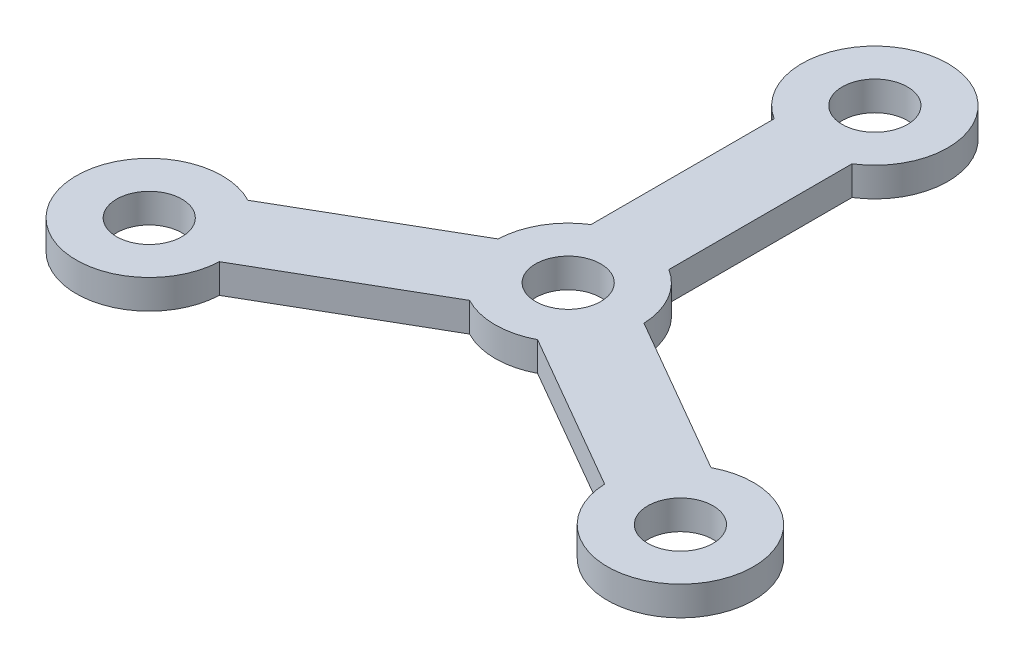
ISO-10303-21;
HEADER;
FILE_DESCRIPTION(('STEP AP214'),'2;1');
FILE_NAME('part.step','',(''),(''),'','','');
FILE_SCHEMA(('AUTOMOTIVE_DESIGN { 1 0 10303 214 1 1 1 1 }'));
ENDSEC;
DATA;
#1=APPLICATION_CONTEXT('core data for automotive mechanical design processes');
#2=APPLICATION_PROTOCOL_DEFINITION('international standard','automotive_design',2000,#1);
#3=PRODUCT_CONTEXT('',#1,'mechanical');
#4=PRODUCT('Part','Part','',(#3));
#5=PRODUCT_RELATED_PRODUCT_CATEGORY('part','',(#4));
#6=PRODUCT_DEFINITION_FORMATION('','',#4);
#7=PRODUCT_DEFINITION_CONTEXT('part definition',#1,'design');
#8=PRODUCT_DEFINITION('design','',#6,#7);
#9=PRODUCT_DEFINITION_SHAPE('','',#8);
#10=(LENGTH_UNIT() NAMED_UNIT(*) SI_UNIT(.MILLI.,.METRE.));
#11=(NAMED_UNIT(*) PLANE_ANGLE_UNIT() SI_UNIT($,.RADIAN.));
#12=(NAMED_UNIT(*) SI_UNIT($,.STERADIAN.) SOLID_ANGLE_UNIT());
#13=UNCERTAINTY_MEASURE_WITH_UNIT(LENGTH_MEASURE(1.E-05),#10,'distance_accuracy_value','');
#14=(GEOMETRIC_REPRESENTATION_CONTEXT(3) GLOBAL_UNCERTAINTY_ASSIGNED_CONTEXT((#13)) GLOBAL_UNIT_ASSIGNED_CONTEXT((#10,
#11,#12)) REPRESENTATION_CONTEXT('',''));
#15=CARTESIAN_POINT('',(0.,0.,0.));
#16=DIRECTION('',(0.,0.,1.));
#17=DIRECTION('',(1.,0.,0.));
#18=AXIS2_PLACEMENT_3D('',#15,#16,#17);
#19=CARTESIAN_POINT('',(0.,3.,-31.5));
#20=DIRECTION('',(0.,-1.,0.));
#21=DIRECTION('',(0.,0.,-1.));
#22=AXIS2_PLACEMENT_3D('',#19,#20,#21);
#23=CYLINDRICAL_SURFACE('',#22,7.5);
#24=CARTESIAN_POINT('',(0.,0.,-31.5));
#25=DIRECTION('',(0.,1.,0.));
#26=DIRECTION('',(0.,0.,1.));
#27=AXIS2_PLACEMENT_3D('',#24,#25,#26);
#28=CIRCLE('',#27,7.5);
#29=CARTESIAN_POINT('',(4.,0.,-25.1557112297752));
#30=VERTEX_POINT('',#29);
#31=CARTESIAN_POINT('',(-4.,0.,-25.1557112297752));
#32=VERTEX_POINT('',#31);
#33=EDGE_CURVE('E217',#30,#32,#28,.T.);
#34=ORIENTED_EDGE('',*,*,#33,.T.);
#35=DIRECTION('',(0.,-1.,0.));
#36=VECTOR('',#35,1.);
#37=CARTESIAN_POINT('',(-4.,3.,-25.1557112297752));
#38=LINE('',#37,#36);
#39=CARTESIAN_POINT('',(-4.,3.,-25.1557112297752));
#40=VERTEX_POINT('',#39);
#41=EDGE_CURVE('E11',#40,#32,#38,.T.);
#42=ORIENTED_EDGE('',*,*,#41,.F.);
#43=CARTESIAN_POINT('',(0.,3.,-31.5));
#44=DIRECTION('',(0.,1.,0.));
#45=DIRECTION('',(0.,0.,1.));
#46=AXIS2_PLACEMENT_3D('',#43,#44,#45);
#47=CIRCLE('',#46,7.5);
#48=CARTESIAN_POINT('',(4.,3.,-25.1557112297752));
#49=VERTEX_POINT('',#48);
#50=EDGE_CURVE('E167',#49,#40,#47,.T.);
#51=ORIENTED_EDGE('',*,*,#50,.F.);
#52=DIRECTION('',(0.,-1.,0.));
#53=VECTOR('',#52,1.);
#54=CARTESIAN_POINT('',(4.,3.,-25.1557112297752));
#55=LINE('',#54,#53);
#56=EDGE_CURVE('E49',#49,#30,#55,.T.);
#57=ORIENTED_EDGE('',*,*,#56,.T.);
#58=EDGE_LOOP('',(#34,#42,#51,#57));
#59=FACE_BOUND('',#58,.T.);
#60=ADVANCED_FACE('F33',(#59),#23,.T.);
#61=CARTESIAN_POINT('',(-4.,3.,0.));
#62=DIRECTION('',(1.,0.,0.));
#63=DIRECTION('',(0.,0.,-1.));
#64=AXIS2_PLACEMENT_3D('',#61,#62,#63);
#65=PLANE('',#64);
#66=DIRECTION('',(0.,0.,1.));
#67=VECTOR('',#66,1.);
#68=CARTESIAN_POINT('',(-4.,0.,0.));
#69=LINE('',#68,#67);
#70=CARTESIAN_POINT('',(-4.,0.,-6.34428877022476));
#71=VERTEX_POINT('',#70);
#72=EDGE_CURVE('E208',#32,#71,#69,.T.);
#73=ORIENTED_EDGE('',*,*,#72,.T.);
#74=DIRECTION('',(0.,-1.,0.));
#75=VECTOR('',#74,1.);
#76=CARTESIAN_POINT('',(-4.,3.,-6.34428877022476));
#77=LINE('',#76,#75);
#78=CARTESIAN_POINT('',(-4.,3.,-6.34428877022476));
#79=VERTEX_POINT('',#78);
#80=EDGE_CURVE('E41',#79,#71,#77,.T.);
#81=ORIENTED_EDGE('',*,*,#80,.F.);
#82=DIRECTION('',(0.,0.,1.));
#83=VECTOR('',#82,1.);
#84=CARTESIAN_POINT('',(-4.,3.,0.));
#85=LINE('',#84,#83);
#86=EDGE_CURVE('E100',#40,#79,#85,.T.);
#87=ORIENTED_EDGE('',*,*,#86,.F.);
#88=ORIENTED_EDGE('',*,*,#41,.T.);
#89=EDGE_LOOP('',(#73,#81,#87,#88));
#90=FACE_BOUND('',#89,.T.);
#91=ADVANCED_FACE('F263',(#90),#65,.F.);
#92=CARTESIAN_POINT('',(0.,3.,0.));
#93=DIRECTION('',(0.,-1.,0.));
#94=DIRECTION('',(0.,0.,-1.));
#95=AXIS2_PLACEMENT_3D('',#92,#93,#94);
#96=CYLINDRICAL_SURFACE('',#95,7.5);
#97=CARTESIAN_POINT('',(0.,0.,0.));
#98=DIRECTION('',(0.,1.,0.));
#99=DIRECTION('',(0.,0.,1.));
#100=AXIS2_PLACEMENT_3D('',#97,#98,#99);
#101=CIRCLE('',#100,7.5);
#102=CARTESIAN_POINT('',(-7.49431524395721,0.,-0.291957230023937));
#103=VERTEX_POINT('',#102);
#104=EDGE_CURVE('E203',#71,#103,#101,.T.);
#105=ORIENTED_EDGE('',*,*,#104,.T.);
#106=DIRECTION('',(0.,-1.,0.));
#107=VECTOR('',#106,1.);
#108=CARTESIAN_POINT('',(-7.49431524395721,3.,-0.291957230023937));
#109=LINE('',#108,#107);
#110=CARTESIAN_POINT('',(-7.49431524395721,3.,-0.291957230023937));
#111=VERTEX_POINT('',#110);
#112=EDGE_CURVE('E197',#111,#103,#109,.T.);
#113=ORIENTED_EDGE('',*,*,#112,.F.);
#114=CARTESIAN_POINT('',(0.,3.,0.));
#115=DIRECTION('',(0.,1.,0.));
#116=DIRECTION('',(0.,0.,1.));
#117=AXIS2_PLACEMENT_3D('',#114,#115,#116);
#118=CIRCLE('',#117,7.5);
#119=EDGE_CURVE('E154',#79,#111,#118,.T.);
#120=ORIENTED_EDGE('',*,*,#119,.F.);
#121=ORIENTED_EDGE('',*,*,#80,.T.);
#122=EDGE_LOOP('',(#105,#113,#120,#121));
#123=FACE_BOUND('',#122,.T.);
#124=ADVANCED_FACE('F202',(#123),#96,.T.);
#125=CARTESIAN_POINT('',(-1.99999999999845,3.,-3.46410161513507));
#126=DIRECTION('',(-0.500000000000001,0.,-0.866025403784438));
#127=DIRECTION('',(-0.866025403784438,0.,0.500000000000001));
#128=AXIS2_PLACEMENT_3D('',#125,#126,#127);
#129=PLANE('',#128);
#130=DIRECTION('',(0.866025403784438,0.,-0.500000000000001));
#131=VECTOR('',#130,1.);
#132=CARTESIAN_POINT('',(-1.99999999999845,0.,-3.46410161513507));
#133=LINE('',#132,#131);
#134=CARTESIAN_POINT('',(-23.7854849752463,0.,9.11375399974964));
#135=VERTEX_POINT('',#134);
#136=EDGE_CURVE('E211',#135,#103,#133,.T.);
#137=ORIENTED_EDGE('',*,*,#136,.F.);
#138=DIRECTION('',(0.,-1.,0.));
#139=VECTOR('',#138,1.);
#140=CARTESIAN_POINT('',(-23.7854849752463,3.,9.11375399974964));
#141=LINE('',#140,#139);
#142=CARTESIAN_POINT('',(-23.7854849752463,3.,9.11375399974964));
#143=VERTEX_POINT('',#142);
#144=EDGE_CURVE('E195',#143,#135,#141,.T.);
#145=ORIENTED_EDGE('',*,*,#144,.F.);
#146=DIRECTION('',(0.866025403784438,0.,-0.500000000000001));
#147=VECTOR('',#146,1.);
#148=CARTESIAN_POINT('',(-1.99999999999845,3.,-3.46410161513507));
#149=LINE('',#148,#147);
#150=EDGE_CURVE('E161',#143,#111,#149,.T.);
#151=ORIENTED_EDGE('',*,*,#150,.T.);
#152=ORIENTED_EDGE('',*,*,#112,.T.);
#153=EDGE_LOOP('',(#137,#145,#151,#152));
#154=FACE_BOUND('',#153,.T.);
#155=ADVANCED_FACE('F317',(#154),#129,.T.);
#156=CARTESIAN_POINT('',(-27.2798002192062,3.,15.7500000000015));
#157=DIRECTION('',(0.,-1.,0.));
#158=DIRECTION('',(0.,0.,-1.));
#159=AXIS2_PLACEMENT_3D('',#156,#157,#158);
#160=CYLINDRICAL_SURFACE('',#159,7.50000000000395);
#161=CARTESIAN_POINT('',(-27.2798002192062,0.,15.7500000000015));
#162=DIRECTION('',(0.,1.,0.));
#163=DIRECTION('',(0.,0.,1.));
#164=AXIS2_PLACEMENT_3D('',#161,#162,#163);
#165=CIRCLE('',#164,7.50000000000395);
#166=CARTESIAN_POINT('',(-19.7854849752453,0.,16.041957230027));
#167=VERTEX_POINT('',#166);
#168=EDGE_CURVE('E215',#135,#167,#165,.T.);
#169=ORIENTED_EDGE('',*,*,#168,.T.);
#170=DIRECTION('',(0.,-1.,0.));
#171=VECTOR('',#170,1.);
#172=CARTESIAN_POINT('',(-19.7854849752453,3.,16.041957230027));
#173=LINE('',#172,#171);
#174=CARTESIAN_POINT('',(-19.7854849752453,3.,16.041957230027));
#175=VERTEX_POINT('',#174);
#176=EDGE_CURVE('E192',#175,#167,#173,.T.);
#177=ORIENTED_EDGE('',*,*,#176,.F.);
#178=CARTESIAN_POINT('',(-27.2798002192062,3.,15.7500000000015));
#179=DIRECTION('',(0.,1.,0.));
#180=DIRECTION('',(0.,0.,1.));
#181=AXIS2_PLACEMENT_3D('',#178,#179,#180);
#182=CIRCLE('',#181,7.50000000000395);
#183=EDGE_CURVE('E166',#143,#175,#182,.T.);
#184=ORIENTED_EDGE('',*,*,#183,.F.);
#185=ORIENTED_EDGE('',*,*,#144,.T.);
#186=EDGE_LOOP('',(#169,#177,#184,#185));
#187=FACE_BOUND('',#186,.T.);
#188=ADVANCED_FACE('F286',(#187),#160,.T.);
#189=CARTESIAN_POINT('',(2.00000000000155,3.,3.46410161514044));
#190=DIRECTION('',(-0.5,0.,-0.866025403784438));
#191=DIRECTION('',(-0.866025403784439,0.,0.5));
#192=AXIS2_PLACEMENT_3D('',#189,#190,#191);
#193=PLANE('',#192);
#194=DIRECTION('',(0.866025403784438,0.,-0.5));
#195=VECTOR('',#194,1.);
#196=CARTESIAN_POINT('',(2.00000000000155,0.,3.46410161514044));
#197=LINE('',#196,#195);
#198=CARTESIAN_POINT('',(-3.49431524395546,0.,6.6362460002518));
#199=VERTEX_POINT('',#198);
#200=EDGE_CURVE('E222',#167,#199,#197,.T.);
#201=ORIENTED_EDGE('',*,*,#200,.T.);
#202=DIRECTION('',(0.,-1.,0.));
#203=VECTOR('',#202,1.);
#204=CARTESIAN_POINT('',(-3.49431524395546,3.,6.6362460002518));
#205=LINE('',#204,#203);
#206=CARTESIAN_POINT('',(-3.49431524395546,3.,6.6362460002518));
#207=VERTEX_POINT('',#206);
#208=EDGE_CURVE('E189',#207,#199,#205,.T.);
#209=ORIENTED_EDGE('',*,*,#208,.F.);
#210=DIRECTION('',(0.866025403784438,0.,-0.5));
#211=VECTOR('',#210,1.);
#212=CARTESIAN_POINT('',(2.00000000000155,3.,3.46410161514044));
#213=LINE('',#212,#211);
#214=EDGE_CURVE('E160',#175,#207,#213,.T.);
#215=ORIENTED_EDGE('',*,*,#214,.F.);
#216=ORIENTED_EDGE('',*,*,#176,.T.);
#217=EDGE_LOOP('',(#201,#209,#215,#216));
#218=FACE_BOUND('',#217,.T.);
#219=ADVANCED_FACE('F287',(#218),#193,.F.);
#220=CARTESIAN_POINT('',(3.49431524396223,0.,6.63624600024806));
#221=VERTEX_POINT('',#220);
#222=EDGE_CURVE('E214',#199,#221,#101,.T.);
#223=ORIENTED_EDGE('',*,*,#222,.T.);
#224=DIRECTION('',(0.,-1.,0.));
#225=VECTOR('',#224,1.);
#226=CARTESIAN_POINT('',(3.49431524396223,3.,6.63624600024806));
#227=LINE('',#226,#225);
#228=CARTESIAN_POINT('',(3.49431524396223,3.,6.63624600024806));
#229=VERTEX_POINT('',#228);
#230=EDGE_CURVE('E187',#229,#221,#227,.T.);
#231=ORIENTED_EDGE('',*,*,#230,.F.);
#232=EDGE_CURVE('E153',#207,#229,#118,.T.);
#233=ORIENTED_EDGE('',*,*,#232,.F.);
#234=ORIENTED_EDGE('',*,*,#208,.T.);
#235=EDGE_LOOP('',(#223,#231,#233,#234));
#236=FACE_BOUND('',#235,.T.);
#237=ADVANCED_FACE('F289',(#236),#96,.T.);
#238=CARTESIAN_POINT('',(-1.9999999999982,3.,3.46410161513465));
#239=DIRECTION('',(-0.5,0.,0.866025403784439));
#240=DIRECTION('',(0.866025403784439,0.,0.5));
#241=AXIS2_PLACEMENT_3D('',#238,#239,#240);
#242=PLANE('',#241);
#243=DIRECTION('',(-0.866025403784439,0.,-0.5));
#244=VECTOR('',#243,1.);
#245=CARTESIAN_POINT('',(-1.9999999999982,0.,3.46410161513465));
#246=LINE('',#245,#244);
#247=CARTESIAN_POINT('',(19.7854849752524,0.,16.0419572300231));
#248=VERTEX_POINT('',#247);
#249=EDGE_CURVE('E221',#248,#221,#246,.T.);
#250=ORIENTED_EDGE('',*,*,#249,.F.);
#251=DIRECTION('',(0.,-1.,0.));
#252=VECTOR('',#251,1.);
#253=CARTESIAN_POINT('',(19.7854849752524,3.,16.0419572300231));
#254=LINE('',#253,#252);
#255=CARTESIAN_POINT('',(19.7854849752524,3.,16.0419572300231));
#256=VERTEX_POINT('',#255);
#257=EDGE_CURVE('E185',#256,#248,#254,.T.);
#258=ORIENTED_EDGE('',*,*,#257,.F.);
#259=DIRECTION('',(-0.866025403784439,0.,-0.5));
#260=VECTOR('',#259,1.);
#261=CARTESIAN_POINT('',(-1.9999999999982,3.,3.46410161513465));
#262=LINE('',#261,#260);
#263=EDGE_CURVE('E159',#256,#229,#262,.T.);
#264=ORIENTED_EDGE('',*,*,#263,.T.);
#265=ORIENTED_EDGE('',*,*,#230,.T.);
#266=EDGE_LOOP('',(#250,#258,#264,#265));
#267=FACE_BOUND('',#266,.T.);
#268=ADVANCED_FACE('F292',(#267),#242,.T.);
#269=CARTESIAN_POINT('',(27.2798002192129,3.,15.7499999999976));
#270=DIRECTION('',(0.,-1.,0.));
#271=DIRECTION('',(0.,0.,-1.));
#272=AXIS2_PLACEMENT_3D('',#269,#270,#271);
#273=CYLINDRICAL_SURFACE('',#272,7.50000000000314);
#274=CARTESIAN_POINT('',(27.2798002192129,0.,15.7499999999976));
#275=DIRECTION('',(0.,1.,0.));
#276=DIRECTION('',(0.,0.,1.));
#277=AXIS2_PLACEMENT_3D('',#274,#275,#276);
#278=CIRCLE('',#277,7.50000000000314);
#279=CARTESIAN_POINT('',(23.7854849752532,0.,9.11375399974611));
#280=VERTEX_POINT('',#279);
#281=EDGE_CURVE('E227',#248,#280,#278,.T.);
#282=ORIENTED_EDGE('',*,*,#281,.T.);
#283=DIRECTION('',(0.,-1.,0.));
#284=VECTOR('',#283,1.);
#285=CARTESIAN_POINT('',(23.7854849752532,3.,9.11375399974611));
#286=LINE('',#285,#284);
#287=CARTESIAN_POINT('',(23.7854849752532,3.,9.11375399974611));
#288=VERTEX_POINT('',#287);
#289=EDGE_CURVE('E148',#288,#280,#286,.T.);
#290=ORIENTED_EDGE('',*,*,#289,.F.);
#291=CARTESIAN_POINT('',(27.2798002192129,3.,15.7499999999976));
#292=DIRECTION('',(0.,1.,0.));
#293=DIRECTION('',(0.,0.,1.));
#294=AXIS2_PLACEMENT_3D('',#291,#292,#293);
#295=CIRCLE('',#294,7.50000000000314);
#296=EDGE_CURVE('E136',#256,#288,#295,.T.);
#297=ORIENTED_EDGE('',*,*,#296,.F.);
#298=ORIENTED_EDGE('',*,*,#257,.T.);
#299=EDGE_LOOP('',(#282,#290,#297,#298));
#300=FACE_BOUND('',#299,.T.);
#301=ADVANCED_FACE('F295',(#300),#273,.T.);
#302=CARTESIAN_POINT('',(2.00000000000179,3.,-3.46410161514087));
#303=DIRECTION('',(-0.5,0.,0.866025403784439));
#304=DIRECTION('',(0.866025403784439,0.,0.5));
#305=AXIS2_PLACEMENT_3D('',#302,#303,#304);
#306=PLANE('',#305);
#307=DIRECTION('',(-0.866025403784439,0.,-0.5));
#308=VECTOR('',#307,1.);
#309=CARTESIAN_POINT('',(2.00000000000179,0.,-3.46410161514087));
#310=LINE('',#309,#308);
#311=CARTESIAN_POINT('',(7.49431524396049,0.,-0.29195723002767));
#312=VERTEX_POINT('',#311);
#313=EDGE_CURVE('E145',#280,#312,#310,.T.);
#314=ORIENTED_EDGE('',*,*,#313,.T.);
#315=DIRECTION('',(0.,-1.,0.));
#316=VECTOR('',#315,1.);
#317=CARTESIAN_POINT('',(7.49431524396049,3.,-0.29195723002767));
#318=LINE('',#317,#316);
#319=CARTESIAN_POINT('',(7.49431524396049,3.,-0.29195723002767));
#320=VERTEX_POINT('',#319);
#321=EDGE_CURVE('E142',#320,#312,#318,.T.);
#322=ORIENTED_EDGE('',*,*,#321,.F.);
#323=DIRECTION('',(-0.866025403784439,0.,-0.5));
#324=VECTOR('',#323,1.);
#325=CARTESIAN_POINT('',(2.00000000000179,3.,-3.46410161514087));
#326=LINE('',#325,#324);
#327=EDGE_CURVE('E127',#288,#320,#326,.T.);
#328=ORIENTED_EDGE('',*,*,#327,.F.);
#329=ORIENTED_EDGE('',*,*,#289,.T.);
#330=EDGE_LOOP('',(#314,#322,#328,#329));
#331=FACE_BOUND('',#330,.T.);
#332=ADVANCED_FACE('F143',(#331),#306,.F.);
#333=CARTESIAN_POINT('',(4.,0.,-6.34428877022476));
#334=VERTEX_POINT('',#333);
#335=EDGE_CURVE('E213',#312,#334,#101,.T.);
#336=ORIENTED_EDGE('',*,*,#335,.T.);
#337=DIRECTION('',(0.,-1.,0.));
#338=VECTOR('',#337,1.);
#339=CARTESIAN_POINT('',(4.,3.,-6.34428877022476));
#340=LINE('',#339,#338);
#341=CARTESIAN_POINT('',(4.,3.,-6.34428877022476));
#342=VERTEX_POINT('',#341);
#343=EDGE_CURVE('E88',#342,#334,#340,.T.);
#344=ORIENTED_EDGE('',*,*,#343,.F.);
#345=EDGE_CURVE('E133',#320,#342,#118,.T.);
#346=ORIENTED_EDGE('',*,*,#345,.F.);
#347=ORIENTED_EDGE('',*,*,#321,.T.);
#348=EDGE_LOOP('',(#336,#344,#346,#347));
#349=FACE_BOUND('',#348,.T.);
#350=ADVANCED_FACE('F150',(#349),#96,.T.);
#351=CARTESIAN_POINT('',(-27.2798002192062,3.,15.7500000000015));
#352=DIRECTION('',(0.,-1.,0.));
#353=DIRECTION('',(0.,0.,-1.));
#354=AXIS2_PLACEMENT_3D('',#351,#352,#353);
#355=CYLINDRICAL_SURFACE('',#354,3.35000000000395);
#356=CARTESIAN_POINT('',(-27.2798002192062,3.,15.7500000000015));
#357=DIRECTION('',(0.,1.,0.));
#358=DIRECTION('',(0.,0.,1.));
#359=AXIS2_PLACEMENT_3D('',#356,#357,#358);
#360=CIRCLE('',#359,3.35000000000395);
#361=CARTESIAN_POINT('',(-27.2798002192062,3.,19.1000000000055));
#362=VERTEX_POINT('',#361);
#363=EDGE_CURVE('E271',#362,#362,#360,.T.);
#364=ORIENTED_EDGE('',*,*,#363,.T.);
#365=EDGE_LOOP('',(#364));
#366=FACE_BOUND('',#365,.T.);
#367=CARTESIAN_POINT('',(-27.2798002192062,0.,15.7500000000015));
#368=DIRECTION('',(0.,1.,0.));
#369=DIRECTION('',(0.,0.,1.));
#370=AXIS2_PLACEMENT_3D('',#367,#368,#369);
#371=CIRCLE('',#370,3.35000000000395);
#372=CARTESIAN_POINT('',(-27.2798002192062,0.,19.1000000000055));
#373=VERTEX_POINT('',#372);
#374=EDGE_CURVE('E172',#373,#373,#371,.T.);
#375=ORIENTED_EDGE('',*,*,#374,.F.);
#376=EDGE_LOOP('',(#375));
#377=FACE_BOUND('',#376,.T.);
#378=ADVANCED_FACE('F249',(#366,#377),#355,.F.);
#379=CARTESIAN_POINT('',(27.2798002192129,3.,15.7499999999976));
#380=DIRECTION('',(0.,-1.,0.));
#381=DIRECTION('',(0.,0.,-1.));
#382=AXIS2_PLACEMENT_3D('',#379,#380,#381);
#383=CYLINDRICAL_SURFACE('',#382,3.35000000000314);
#384=CARTESIAN_POINT('',(27.2798002192129,3.,15.7499999999976));
#385=DIRECTION('',(0.,1.,0.));
#386=DIRECTION('',(0.,0.,1.));
#387=AXIS2_PLACEMENT_3D('',#384,#385,#386);
#388=CIRCLE('',#387,3.35000000000314);
#389=CARTESIAN_POINT('',(27.2798002192129,3.,19.1000000000008));
#390=VERTEX_POINT('',#389);
#391=EDGE_CURVE('E274',#390,#390,#388,.T.);
#392=ORIENTED_EDGE('',*,*,#391,.T.);
#393=EDGE_LOOP('',(#392));
#394=FACE_BOUND('',#393,.T.);
#395=CARTESIAN_POINT('',(27.2798002192129,0.,15.7499999999976));
#396=DIRECTION('',(0.,1.,0.));
#397=DIRECTION('',(0.,0.,1.));
#398=AXIS2_PLACEMENT_3D('',#395,#396,#397);
#399=CIRCLE('',#398,3.35000000000314);
#400=CARTESIAN_POINT('',(27.2798002192129,0.,19.1000000000008));
#401=VERTEX_POINT('',#400);
#402=EDGE_CURVE('E177',#401,#401,#399,.T.);
#403=ORIENTED_EDGE('',*,*,#402,.F.);
#404=EDGE_LOOP('',(#403));
#405=FACE_BOUND('',#404,.T.);
#406=ADVANCED_FACE('F246',(#394,#405),#383,.F.);
#407=CARTESIAN_POINT('',(0.,3.,-31.5));
#408=DIRECTION('',(0.,-1.,0.));
#409=DIRECTION('',(0.,0.,-1.));
#410=AXIS2_PLACEMENT_3D('',#407,#408,#409);
#411=CYLINDRICAL_SURFACE('',#410,3.35);
#412=CARTESIAN_POINT('',(0.,3.,-31.5));
#413=DIRECTION('',(0.,1.,0.));
#414=DIRECTION('',(0.,0.,1.));
#415=AXIS2_PLACEMENT_3D('',#412,#413,#414);
#416=CIRCLE('',#415,3.35);
#417=CARTESIAN_POINT('',(0.,3.,-28.15));
#418=VERTEX_POINT('',#417);
#419=EDGE_CURVE('E155',#418,#418,#416,.T.);
#420=ORIENTED_EDGE('',*,*,#419,.T.);
#421=EDGE_LOOP('',(#420));
#422=FACE_BOUND('',#421,.T.);
#423=CARTESIAN_POINT('',(0.,0.,-31.5));
#424=DIRECTION('',(0.,1.,0.));
#425=DIRECTION('',(0.,0.,1.));
#426=AXIS2_PLACEMENT_3D('',#423,#424,#425);
#427=CIRCLE('',#426,3.35);
#428=CARTESIAN_POINT('',(0.,0.,-28.15));
#429=VERTEX_POINT('',#428);
#430=EDGE_CURVE('E239',#429,#429,#427,.T.);
#431=ORIENTED_EDGE('',*,*,#430,.F.);
#432=EDGE_LOOP('',(#431));
#433=FACE_BOUND('',#432,.T.);
#434=ADVANCED_FACE('F248',(#422,#433),#411,.F.);
#435=CARTESIAN_POINT('',(4.00000000000001,3.,0.));
#436=DIRECTION('',(1.,0.,0.));
#437=DIRECTION('',(0.,0.,-1.));
#438=AXIS2_PLACEMENT_3D('',#435,#436,#437);
#439=PLANE('',#438);
#440=DIRECTION('',(0.,0.,1.));
#441=VECTOR('',#440,1.);
#442=CARTESIAN_POINT('',(4.00000000000001,0.,0.));
#443=LINE('',#442,#441);
#444=EDGE_CURVE('E219',#30,#334,#443,.T.);
#445=ORIENTED_EDGE('',*,*,#444,.F.);
#446=ORIENTED_EDGE('',*,*,#56,.F.);
#447=DIRECTION('',(0.,0.,1.));
#448=VECTOR('',#447,1.);
#449=CARTESIAN_POINT('',(4.00000000000001,3.,0.));
#450=LINE('',#449,#448);
#451=EDGE_CURVE('E151',#49,#342,#450,.T.);
#452=ORIENTED_EDGE('',*,*,#451,.T.);
#453=ORIENTED_EDGE('',*,*,#343,.T.);
#454=EDGE_LOOP('',(#445,#446,#452,#453));
#455=FACE_BOUND('',#454,.T.);
#456=ADVANCED_FACE('F256',(#455),#439,.T.);
#457=CARTESIAN_POINT('',(0.,3.,0.));
#458=DIRECTION('',(0.,-1.,0.));
#459=DIRECTION('',(0.,0.,-1.));
#460=AXIS2_PLACEMENT_3D('',#457,#458,#459);
#461=CYLINDRICAL_SURFACE('',#460,3.35);
#462=CARTESIAN_POINT('',(0.,3.,0.));
#463=DIRECTION('',(0.,1.,0.));
#464=DIRECTION('',(0.,0.,1.));
#465=AXIS2_PLACEMENT_3D('',#462,#463,#464);
#466=CIRCLE('',#465,3.35);
#467=CARTESIAN_POINT('',(0.,3.,3.35));
#468=VERTEX_POINT('',#467);
#469=EDGE_CURVE('E182',#468,#468,#466,.T.);
#470=ORIENTED_EDGE('',*,*,#469,.T.);
#471=EDGE_LOOP('',(#470));
#472=FACE_BOUND('',#471,.T.);
#473=CARTESIAN_POINT('',(0.,0.,0.));
#474=DIRECTION('',(0.,1.,0.));
#475=DIRECTION('',(0.,0.,1.));
#476=AXIS2_PLACEMENT_3D('',#473,#474,#475);
#477=CIRCLE('',#476,3.35);
#478=CARTESIAN_POINT('',(0.,0.,3.35));
#479=VERTEX_POINT('',#478);
#480=EDGE_CURVE('E168',#479,#479,#477,.T.);
#481=ORIENTED_EDGE('',*,*,#480,.F.);
#482=EDGE_LOOP('',(#481));
#483=FACE_BOUND('',#482,.T.);
#484=ADVANCED_FACE('F297',(#472,#483),#461,.F.);
#485=CARTESIAN_POINT('',(0.,3.,0.));
#486=DIRECTION('',(0.,1.,0.));
#487=DIRECTION('',(0.,0.,1.));
#488=AXIS2_PLACEMENT_3D('',#485,#486,#487);
#489=PLANE('',#488);
#490=ORIENTED_EDGE('',*,*,#50,.T.);
#491=ORIENTED_EDGE('',*,*,#86,.T.);
#492=ORIENTED_EDGE('',*,*,#119,.T.);
#493=ORIENTED_EDGE('',*,*,#150,.F.);
#494=ORIENTED_EDGE('',*,*,#183,.T.);
#495=ORIENTED_EDGE('',*,*,#214,.T.);
#496=ORIENTED_EDGE('',*,*,#232,.T.);
#497=ORIENTED_EDGE('',*,*,#263,.F.);
#498=ORIENTED_EDGE('',*,*,#296,.T.);
#499=ORIENTED_EDGE('',*,*,#327,.T.);
#500=ORIENTED_EDGE('',*,*,#345,.T.);
#501=ORIENTED_EDGE('',*,*,#451,.F.);
#502=EDGE_LOOP('',(#490,#491,#492,#493,#494,#495,#496,#497,#498,#499,#500,#501));
#503=FACE_BOUND('',#502,.T.);
#504=ORIENTED_EDGE('',*,*,#419,.F.);
#505=EDGE_LOOP('',(#504));
#506=FACE_BOUND('',#505,.T.);
#507=ORIENTED_EDGE('',*,*,#391,.F.);
#508=EDGE_LOOP('',(#507));
#509=FACE_BOUND('',#508,.T.);
#510=ORIENTED_EDGE('',*,*,#363,.F.);
#511=EDGE_LOOP('',(#510));
#512=FACE_BOUND('',#511,.T.);
#513=ORIENTED_EDGE('',*,*,#469,.F.);
#514=EDGE_LOOP('',(#513));
#515=FACE_BOUND('',#514,.T.);
#516=ADVANCED_FACE('F129',(#503,#506,#509,#512,#515),#489,.T.);
#517=CARTESIAN_POINT('',(0.,0.,0.));
#518=DIRECTION('',(0.,1.,0.));
#519=DIRECTION('',(0.,0.,1.));
#520=AXIS2_PLACEMENT_3D('',#517,#518,#519);
#521=PLANE('',#520);
#522=ORIENTED_EDGE('',*,*,#33,.F.);
#523=ORIENTED_EDGE('',*,*,#444,.T.);
#524=ORIENTED_EDGE('',*,*,#335,.F.);
#525=ORIENTED_EDGE('',*,*,#313,.F.);
#526=ORIENTED_EDGE('',*,*,#281,.F.);
#527=ORIENTED_EDGE('',*,*,#249,.T.);
#528=ORIENTED_EDGE('',*,*,#222,.F.);
#529=ORIENTED_EDGE('',*,*,#200,.F.);
#530=ORIENTED_EDGE('',*,*,#168,.F.);
#531=ORIENTED_EDGE('',*,*,#136,.T.);
#532=ORIENTED_EDGE('',*,*,#104,.F.);
#533=ORIENTED_EDGE('',*,*,#72,.F.);
#534=EDGE_LOOP('',(#522,#523,#524,#525,#526,#527,#528,#529,#530,#531,#532,#533));
#535=FACE_BOUND('',#534,.T.);
#536=ORIENTED_EDGE('',*,*,#430,.T.);
#537=EDGE_LOOP('',(#536));
#538=FACE_BOUND('',#537,.T.);
#539=ORIENTED_EDGE('',*,*,#402,.T.);
#540=EDGE_LOOP('',(#539));
#541=FACE_BOUND('',#540,.T.);
#542=ORIENTED_EDGE('',*,*,#374,.T.);
#543=EDGE_LOOP('',(#542));
#544=FACE_BOUND('',#543,.T.);
#545=ORIENTED_EDGE('',*,*,#480,.T.);
#546=EDGE_LOOP('',(#545));
#547=FACE_BOUND('',#546,.T.);
#548=ADVANCED_FACE('F206',(#535,#538,#541,#544,#547),#521,.F.);
#549=CLOSED_SHELL('',(#60,#91,#124,#155,#188,#219,#237,#268,#301,#332,#350,#378,#406,#434,#456,
#484,#516,#548));
#550=MANIFOLD_SOLID_BREP('B2',#549);
#551=ADVANCED_BREP_SHAPE_REPRESENTATION('',(#18,#550),#14);
#552=SHAPE_DEFINITION_REPRESENTATION(#9,#551);
ENDSEC;
END-ISO-10303-21;
